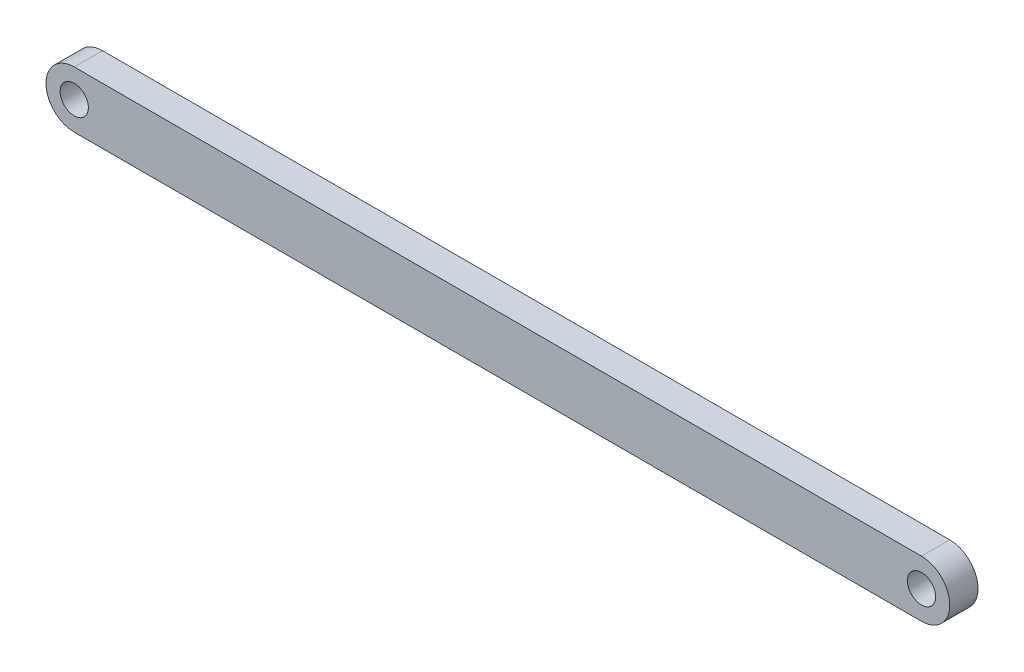
ISO-10303-21;
HEADER;
FILE_DESCRIPTION(('STEP AP214'),'2;1');
FILE_NAME('part.step','',(''),(''),'','','');
FILE_SCHEMA(('AUTOMOTIVE_DESIGN { 1 0 10303 214 1 1 1 1 }'));
ENDSEC;
DATA;
#1=APPLICATION_CONTEXT('core data for automotive mechanical design processes');
#2=APPLICATION_PROTOCOL_DEFINITION('international standard','automotive_design',2000,#1);
#3=PRODUCT_CONTEXT('',#1,'mechanical');
#4=PRODUCT('Part','Part','',(#3));
#5=PRODUCT_RELATED_PRODUCT_CATEGORY('part','',(#4));
#6=PRODUCT_DEFINITION_FORMATION('','',#4);
#7=PRODUCT_DEFINITION_CONTEXT('part definition',#1,'design');
#8=PRODUCT_DEFINITION('design','',#6,#7);
#9=PRODUCT_DEFINITION_SHAPE('','',#8);
#10=(LENGTH_UNIT() NAMED_UNIT(*) SI_UNIT(.MILLI.,.METRE.));
#11=(NAMED_UNIT(*) PLANE_ANGLE_UNIT() SI_UNIT($,.RADIAN.));
#12=(NAMED_UNIT(*) SI_UNIT($,.STERADIAN.) SOLID_ANGLE_UNIT());
#13=UNCERTAINTY_MEASURE_WITH_UNIT(LENGTH_MEASURE(1.E-05),#10,'distance_accuracy_value','');
#14=(GEOMETRIC_REPRESENTATION_CONTEXT(3) GLOBAL_UNCERTAINTY_ASSIGNED_CONTEXT((#13)) GLOBAL_UNIT_ASSIGNED_CONTEXT((#10,
#11,#12)) REPRESENTATION_CONTEXT('',''));
#15=CARTESIAN_POINT('',(0.,0.,0.));
#16=DIRECTION('',(0.,0.,1.));
#17=DIRECTION('',(1.,0.,0.));
#18=AXIS2_PLACEMENT_3D('',#15,#16,#17);
#19=CARTESIAN_POINT('',(150.,0.,10.));
#20=DIRECTION('',(0.,0.,-1.));
#21=DIRECTION('',(-1.,0.,0.));
#22=AXIS2_PLACEMENT_3D('',#19,#20,#21);
#23=PLANE('',#22);
#24=CARTESIAN_POINT('',(150.,0.,10.));
#25=DIRECTION('',(0.,0.,1.));
#26=DIRECTION('',(-1.,0.,0.));
#27=AXIS2_PLACEMENT_3D('',#24,#25,#26);
#28=CIRCLE('',#27,10.0000000000001);
#29=CARTESIAN_POINT('',(150.,-10.0000000000001,10.));
#30=VERTEX_POINT('',#29);
#31=CARTESIAN_POINT('',(150.,10.0000000000001,10.));
#32=VERTEX_POINT('',#31);
#33=EDGE_CURVE('E96',#30,#32,#28,.T.);
#34=ORIENTED_EDGE('',*,*,#33,.T.);
#35=DIRECTION('',(-1.,0.,0.));
#36=VECTOR('',#35,1.);
#37=CARTESIAN_POINT('',(-150.,10.,10.));
#38=LINE('',#37,#36);
#39=CARTESIAN_POINT('',(-150.,10.,10.));
#40=VERTEX_POINT('',#39);
#41=EDGE_CURVE('E91',#32,#40,#38,.T.);
#42=ORIENTED_EDGE('',*,*,#41,.T.);
#43=CARTESIAN_POINT('',(-150.,0.,10.));
#44=DIRECTION('',(0.,0.,1.));
#45=DIRECTION('',(1.,0.,0.));
#46=AXIS2_PLACEMENT_3D('',#43,#44,#45);
#47=CIRCLE('',#46,10.0000000000001);
#48=CARTESIAN_POINT('',(-150.,-10.0000000000001,10.));
#49=VERTEX_POINT('',#48);
#50=EDGE_CURVE('E94',#40,#49,#47,.T.);
#51=ORIENTED_EDGE('',*,*,#50,.T.);
#52=DIRECTION('',(1.,0.,0.));
#53=VECTOR('',#52,1.);
#54=CARTESIAN_POINT('',(-150.,-10.0000000000001,10.));
#55=LINE('',#54,#53);
#56=EDGE_CURVE('E61',#49,#30,#55,.T.);
#57=ORIENTED_EDGE('',*,*,#56,.T.);
#58=EDGE_LOOP('',(#34,#42,#51,#57));
#59=FACE_BOUND('',#58,.T.);
#60=CARTESIAN_POINT('',(-150.,0.,10.));
#61=DIRECTION('',(0.,0.,1.));
#62=DIRECTION('',(1.,0.,0.));
#63=AXIS2_PLACEMENT_3D('',#60,#61,#62);
#64=CIRCLE('',#63,5.00000000000002);
#65=CARTESIAN_POINT('',(-145.,0.,10.));
#66=VERTEX_POINT('',#65);
#67=EDGE_CURVE('E116',#66,#66,#64,.T.);
#68=ORIENTED_EDGE('',*,*,#67,.F.);
#69=EDGE_LOOP('',(#68));
#70=FACE_BOUND('',#69,.T.);
#71=CARTESIAN_POINT('',(150.,0.,10.));
#72=DIRECTION('',(0.,0.,1.));
#73=DIRECTION('',(1.,0.,0.));
#74=AXIS2_PLACEMENT_3D('',#71,#72,#73);
#75=CIRCLE('',#74,5.00000000000002);
#76=CARTESIAN_POINT('',(155.,0.,10.));
#77=VERTEX_POINT('',#76);
#78=EDGE_CURVE('E138',#77,#77,#75,.T.);
#79=ORIENTED_EDGE('',*,*,#78,.F.);
#80=EDGE_LOOP('',(#79));
#81=FACE_BOUND('',#80,.T.);
#82=ADVANCED_FACE('F43',(#59,#70,#81),#23,.F.);
#83=CARTESIAN_POINT('',(150.,0.,0.));
#84=DIRECTION('',(0.,0.,-1.));
#85=DIRECTION('',(-1.,0.,0.));
#86=AXIS2_PLACEMENT_3D('',#83,#84,#85);
#87=PLANE('',#86);
#88=CARTESIAN_POINT('',(-150.,0.,0.));
#89=DIRECTION('',(0.,0.,1.));
#90=DIRECTION('',(1.,0.,0.));
#91=AXIS2_PLACEMENT_3D('',#88,#89,#90);
#92=CIRCLE('',#91,5.00000000000002);
#93=CARTESIAN_POINT('',(-145.,0.,0.));
#94=VERTEX_POINT('',#93);
#95=EDGE_CURVE('E134',#94,#94,#92,.T.);
#96=ORIENTED_EDGE('',*,*,#95,.T.);
#97=EDGE_LOOP('',(#96));
#98=FACE_BOUND('',#97,.T.);
#99=CARTESIAN_POINT('',(150.,0.,0.));
#100=DIRECTION('',(0.,0.,1.));
#101=DIRECTION('',(-1.,0.,0.));
#102=AXIS2_PLACEMENT_3D('',#99,#100,#101);
#103=CIRCLE('',#102,10.0000000000001);
#104=CARTESIAN_POINT('',(150.,-10.0000000000001,0.));
#105=VERTEX_POINT('',#104);
#106=CARTESIAN_POINT('',(150.,10.0000000000001,0.));
#107=VERTEX_POINT('',#106);
#108=EDGE_CURVE('E112',#105,#107,#103,.T.);
#109=ORIENTED_EDGE('',*,*,#108,.F.);
#110=DIRECTION('',(1.,0.,0.));
#111=VECTOR('',#110,1.);
#112=CARTESIAN_POINT('',(-150.,-10.0000000000001,0.));
#113=LINE('',#112,#111);
#114=CARTESIAN_POINT('',(-150.,-10.0000000000001,0.));
#115=VERTEX_POINT('',#114);
#116=EDGE_CURVE('E84',#115,#105,#113,.T.);
#117=ORIENTED_EDGE('',*,*,#116,.F.);
#118=CARTESIAN_POINT('',(-150.,0.,0.));
#119=DIRECTION('',(0.,0.,1.));
#120=DIRECTION('',(1.,0.,0.));
#121=AXIS2_PLACEMENT_3D('',#118,#119,#120);
#122=CIRCLE('',#121,10.0000000000001);
#123=CARTESIAN_POINT('',(-150.,10.,0.));
#124=VERTEX_POINT('',#123);
#125=EDGE_CURVE('E78',#124,#115,#122,.T.);
#126=ORIENTED_EDGE('',*,*,#125,.F.);
#127=DIRECTION('',(-1.,0.,0.));
#128=VECTOR('',#127,1.);
#129=CARTESIAN_POINT('',(-150.,10.,0.));
#130=LINE('',#129,#128);
#131=EDGE_CURVE('E101',#107,#124,#130,.T.);
#132=ORIENTED_EDGE('',*,*,#131,.F.);
#133=EDGE_LOOP('',(#109,#117,#126,#132));
#134=FACE_BOUND('',#133,.T.);
#135=CARTESIAN_POINT('',(150.,0.,0.));
#136=DIRECTION('',(0.,0.,1.));
#137=DIRECTION('',(1.,0.,0.));
#138=AXIS2_PLACEMENT_3D('',#135,#136,#137);
#139=CIRCLE('',#138,5.00000000000002);
#140=CARTESIAN_POINT('',(155.,0.,0.));
#141=VERTEX_POINT('',#140);
#142=EDGE_CURVE('E142',#141,#141,#139,.T.);
#143=ORIENTED_EDGE('',*,*,#142,.T.);
#144=EDGE_LOOP('',(#143));
#145=FACE_BOUND('',#144,.T.);
#146=ADVANCED_FACE('F129',(#98,#134,#145),#87,.T.);
#147=CARTESIAN_POINT('',(150.,0.,10.));
#148=DIRECTION('',(0.,0.,-1.));
#149=DIRECTION('',(-1.,0.,0.));
#150=AXIS2_PLACEMENT_3D('',#147,#148,#149);
#151=CYLINDRICAL_SURFACE('',#150,10.0000000000001);
#152=ORIENTED_EDGE('',*,*,#108,.T.);
#153=DIRECTION('',(0.,0.,-1.));
#154=VECTOR('',#153,1.);
#155=CARTESIAN_POINT('',(150.,10.0000000000001,10.));
#156=LINE('',#155,#154);
#157=EDGE_CURVE('E11',#32,#107,#156,.T.);
#158=ORIENTED_EDGE('',*,*,#157,.F.);
#159=ORIENTED_EDGE('',*,*,#33,.F.);
#160=DIRECTION('',(0.,0.,-1.));
#161=VECTOR('',#160,1.);
#162=CARTESIAN_POINT('',(150.,-10.0000000000001,10.));
#163=LINE('',#162,#161);
#164=EDGE_CURVE('E108',#30,#105,#163,.T.);
#165=ORIENTED_EDGE('',*,*,#164,.T.);
#166=EDGE_LOOP('',(#152,#158,#159,#165));
#167=FACE_BOUND('',#166,.T.);
#168=ADVANCED_FACE('F45',(#167),#151,.T.);
#169=CARTESIAN_POINT('',(-150.,10.,10.));
#170=DIRECTION('',(0.,-1.,0.));
#171=DIRECTION('',(1.,0.,0.));
#172=AXIS2_PLACEMENT_3D('',#169,#170,#171);
#173=PLANE('',#172);
#174=ORIENTED_EDGE('',*,*,#131,.T.);
#175=DIRECTION('',(0.,0.,-1.));
#176=VECTOR('',#175,1.);
#177=CARTESIAN_POINT('',(-150.,10.,10.));
#178=LINE('',#177,#176);
#179=EDGE_CURVE('E53',#40,#124,#178,.T.);
#180=ORIENTED_EDGE('',*,*,#179,.F.);
#181=ORIENTED_EDGE('',*,*,#41,.F.);
#182=ORIENTED_EDGE('',*,*,#157,.T.);
#183=EDGE_LOOP('',(#174,#180,#181,#182));
#184=FACE_BOUND('',#183,.T.);
#185=ADVANCED_FACE('F100',(#184),#173,.F.);
#186=CARTESIAN_POINT('',(-150.,0.,10.));
#187=DIRECTION('',(0.,0.,-1.));
#188=DIRECTION('',(-1.,0.,0.));
#189=AXIS2_PLACEMENT_3D('',#186,#187,#188);
#190=CYLINDRICAL_SURFACE('',#189,10.0000000000001);
#191=ORIENTED_EDGE('',*,*,#125,.T.);
#192=DIRECTION('',(0.,0.,-1.));
#193=VECTOR('',#192,1.);
#194=CARTESIAN_POINT('',(-150.,-10.0000000000001,10.));
#195=LINE('',#194,#193);
#196=EDGE_CURVE('E103',#49,#115,#195,.T.);
#197=ORIENTED_EDGE('',*,*,#196,.F.);
#198=ORIENTED_EDGE('',*,*,#50,.F.);
#199=ORIENTED_EDGE('',*,*,#179,.T.);
#200=EDGE_LOOP('',(#191,#197,#198,#199));
#201=FACE_BOUND('',#200,.T.);
#202=ADVANCED_FACE('F104',(#201),#190,.T.);
#203=CARTESIAN_POINT('',(-150.,-10.0000000000001,10.));
#204=DIRECTION('',(0.,1.,0.));
#205=DIRECTION('',(-1.,0.,0.));
#206=AXIS2_PLACEMENT_3D('',#203,#204,#205);
#207=PLANE('',#206);
#208=ORIENTED_EDGE('',*,*,#116,.T.);
#209=ORIENTED_EDGE('',*,*,#164,.F.);
#210=ORIENTED_EDGE('',*,*,#56,.F.);
#211=ORIENTED_EDGE('',*,*,#196,.T.);
#212=EDGE_LOOP('',(#208,#209,#210,#211));
#213=FACE_BOUND('',#212,.T.);
#214=ADVANCED_FACE('F126',(#213),#207,.F.);
#215=CARTESIAN_POINT('',(-150.,0.,10.));
#216=DIRECTION('',(0.,0.,-1.));
#217=DIRECTION('',(-1.,0.,0.));
#218=AXIS2_PLACEMENT_3D('',#215,#216,#217);
#219=CYLINDRICAL_SURFACE('',#218,5.00000000000002);
#220=ORIENTED_EDGE('',*,*,#67,.T.);
#221=EDGE_LOOP('',(#220));
#222=FACE_BOUND('',#221,.T.);
#223=ORIENTED_EDGE('',*,*,#95,.F.);
#224=EDGE_LOOP('',(#223));
#225=FACE_BOUND('',#224,.T.);
#226=ADVANCED_FACE('F161',(#222,#225),#219,.F.);
#227=CARTESIAN_POINT('',(150.,0.,10.));
#228=DIRECTION('',(0.,0.,-1.));
#229=DIRECTION('',(-1.,0.,0.));
#230=AXIS2_PLACEMENT_3D('',#227,#228,#229);
#231=CYLINDRICAL_SURFACE('',#230,5.00000000000002);
#232=ORIENTED_EDGE('',*,*,#78,.T.);
#233=EDGE_LOOP('',(#232));
#234=FACE_BOUND('',#233,.T.);
#235=ORIENTED_EDGE('',*,*,#142,.F.);
#236=EDGE_LOOP('',(#235));
#237=FACE_BOUND('',#236,.T.);
#238=ADVANCED_FACE('F150',(#234,#237),#231,.F.);
#239=CLOSED_SHELL('',(#82,#146,#168,#185,#202,#214,#226,#238));
#240=MANIFOLD_SOLID_BREP('B2',#239);
#241=ADVANCED_BREP_SHAPE_REPRESENTATION('',(#18,#240),#14);
#242=SHAPE_DEFINITION_REPRESENTATION(#9,#241);
ENDSEC;
END-ISO-10303-21;
